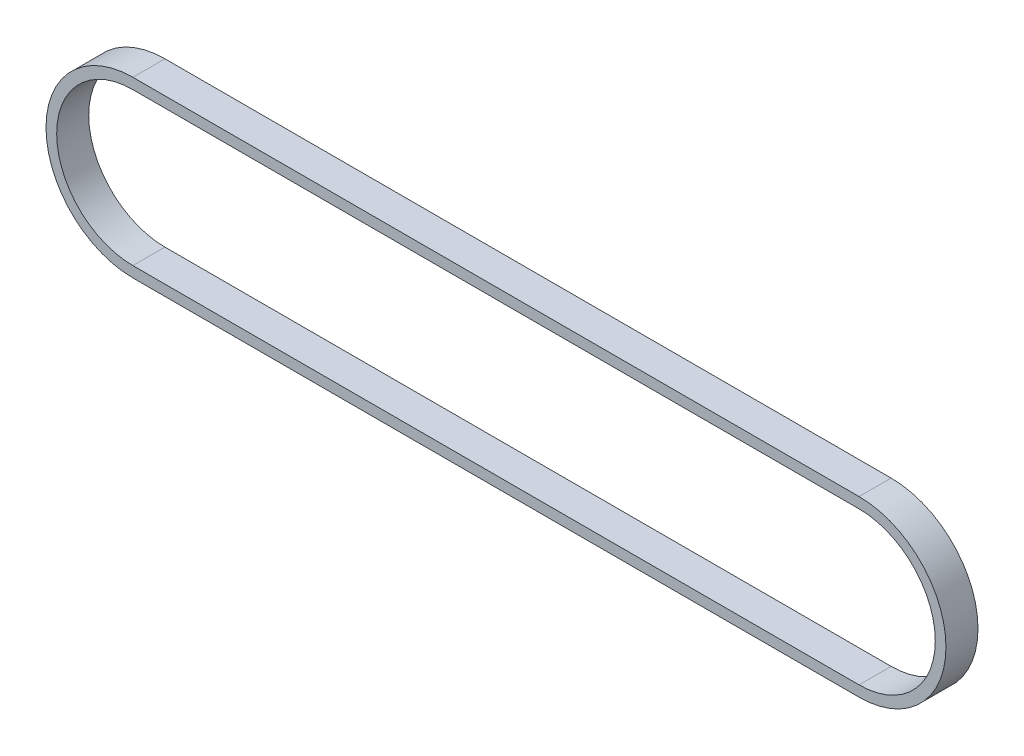
ISO-10303-21;
HEADER;
FILE_DESCRIPTION(('STEP AP214'),'2;1');
FILE_NAME('part.step','',(''),(''),'','','');
FILE_SCHEMA(('AUTOMOTIVE_DESIGN { 1 0 10303 214 1 1 1 1 }'));
ENDSEC;
DATA;
#1=APPLICATION_CONTEXT('core data for automotive mechanical design processes');
#2=APPLICATION_PROTOCOL_DEFINITION('international standard','automotive_design',2000,#1);
#3=PRODUCT_CONTEXT('',#1,'mechanical');
#4=PRODUCT('Part','Part','',(#3));
#5=PRODUCT_RELATED_PRODUCT_CATEGORY('part','',(#4));
#6=PRODUCT_DEFINITION_FORMATION('','',#4);
#7=PRODUCT_DEFINITION_CONTEXT('part definition',#1,'design');
#8=PRODUCT_DEFINITION('design','',#6,#7);
#9=PRODUCT_DEFINITION_SHAPE('','',#8);
#10=(LENGTH_UNIT() NAMED_UNIT(*) SI_UNIT(.MILLI.,.METRE.));
#11=(NAMED_UNIT(*) PLANE_ANGLE_UNIT() SI_UNIT($,.RADIAN.));
#12=(NAMED_UNIT(*) SI_UNIT($,.STERADIAN.) SOLID_ANGLE_UNIT());
#13=UNCERTAINTY_MEASURE_WITH_UNIT(LENGTH_MEASURE(1.E-05),#10,'distance_accuracy_value','');
#14=(GEOMETRIC_REPRESENTATION_CONTEXT(3) GLOBAL_UNCERTAINTY_ASSIGNED_CONTEXT((#13)) GLOBAL_UNIT_ASSIGNED_CONTEXT((#10,
#11,#12)) REPRESENTATION_CONTEXT('',''));
#15=CARTESIAN_POINT('',(0.,0.,0.));
#16=DIRECTION('',(0.,0.,1.));
#17=DIRECTION('',(1.,0.,0.));
#18=AXIS2_PLACEMENT_3D('',#15,#16,#17);
#19=CARTESIAN_POINT('',(0.,0.,4.5));
#20=DIRECTION('',(0.,0.,-1.));
#21=DIRECTION('',(-1.,0.,0.));
#22=AXIS2_PLACEMENT_3D('',#19,#20,#21);
#23=CYLINDRICAL_SURFACE('',#22,21.4);
#24=CARTESIAN_POINT('',(0.,0.,-4.5));
#25=DIRECTION('',(0.,0.,1.));
#26=DIRECTION('',(1.,0.,0.));
#27=AXIS2_PLACEMENT_3D('',#24,#25,#26);
#28=CIRCLE('',#27,21.4);
#29=CARTESIAN_POINT('',(0.,21.4,-4.5));
#30=VERTEX_POINT('',#29);
#31=CARTESIAN_POINT('',(0.,-21.4,-4.5));
#32=VERTEX_POINT('',#31);
#33=EDGE_CURVE('E145',#30,#32,#28,.T.);
#34=ORIENTED_EDGE('',*,*,#33,.F.);
#35=DIRECTION('',(0.,0.,-1.));
#36=VECTOR('',#35,1.);
#37=CARTESIAN_POINT('',(0.,21.4,4.5));
#38=LINE('',#37,#36);
#39=CARTESIAN_POINT('',(0.,21.4,4.5));
#40=VERTEX_POINT('',#39);
#41=EDGE_CURVE('E11',#40,#30,#38,.T.);
#42=ORIENTED_EDGE('',*,*,#41,.F.);
#43=CARTESIAN_POINT('',(0.,0.,4.5));
#44=DIRECTION('',(0.,0.,1.));
#45=DIRECTION('',(1.,0.,0.));
#46=AXIS2_PLACEMENT_3D('',#43,#44,#45);
#47=CIRCLE('',#46,21.4);
#48=CARTESIAN_POINT('',(0.,-21.4,4.5));
#49=VERTEX_POINT('',#48);
#50=EDGE_CURVE('E117',#40,#49,#47,.T.);
#51=ORIENTED_EDGE('',*,*,#50,.T.);
#52=DIRECTION('',(0.,0.,-1.));
#53=VECTOR('',#52,1.);
#54=CARTESIAN_POINT('',(0.,-21.4,4.5));
#55=LINE('',#54,#53);
#56=EDGE_CURVE('E56',#49,#32,#55,.T.);
#57=ORIENTED_EDGE('',*,*,#56,.T.);
#58=EDGE_LOOP('',(#34,#42,#51,#57));
#59=FACE_BOUND('',#58,.T.);
#60=ADVANCED_FACE('F37',(#59),#23,.F.);
#61=CARTESIAN_POINT('',(0.,21.4,4.5));
#62=DIRECTION('',(0.,1.,0.));
#63=DIRECTION('',(0.,0.,1.));
#64=AXIS2_PLACEMENT_3D('',#61,#62,#63);
#65=PLANE('',#64);
#66=DIRECTION('',(1.,0.,0.));
#67=VECTOR('',#66,1.);
#68=CARTESIAN_POINT('',(0.,21.4,-4.5));
#69=LINE('',#68,#67);
#70=CARTESIAN_POINT('',(203.94484,21.4,-4.5));
#71=VERTEX_POINT('',#70);
#72=EDGE_CURVE('E123',#30,#71,#69,.T.);
#73=ORIENTED_EDGE('',*,*,#72,.T.);
#74=DIRECTION('',(0.,0.,-1.));
#75=VECTOR('',#74,1.);
#76=CARTESIAN_POINT('',(203.94484,21.4,4.5));
#77=LINE('',#76,#75);
#78=CARTESIAN_POINT('',(203.94484,21.4,4.5));
#79=VERTEX_POINT('',#78);
#80=EDGE_CURVE('E47',#79,#71,#77,.T.);
#81=ORIENTED_EDGE('',*,*,#80,.F.);
#82=DIRECTION('',(1.,0.,0.));
#83=VECTOR('',#82,1.);
#84=CARTESIAN_POINT('',(0.,21.4,4.5));
#85=LINE('',#84,#83);
#86=EDGE_CURVE('E111',#40,#79,#85,.T.);
#87=ORIENTED_EDGE('',*,*,#86,.F.);
#88=ORIENTED_EDGE('',*,*,#41,.T.);
#89=EDGE_LOOP('',(#73,#81,#87,#88));
#90=FACE_BOUND('',#89,.T.);
#91=ADVANCED_FACE('F121',(#90),#65,.F.);
#92=CARTESIAN_POINT('',(203.94484,0.,4.5));
#93=DIRECTION('',(0.,0.,-1.));
#94=DIRECTION('',(-1.,0.,0.));
#95=AXIS2_PLACEMENT_3D('',#92,#93,#94);
#96=CYLINDRICAL_SURFACE('',#95,21.4);
#97=CARTESIAN_POINT('',(203.94484,0.,-4.5));
#98=DIRECTION('',(0.,0.,1.));
#99=DIRECTION('',(1.,0.,0.));
#100=AXIS2_PLACEMENT_3D('',#97,#98,#99);
#101=CIRCLE('',#100,21.4);
#102=CARTESIAN_POINT('',(203.94484,-21.4,-4.5));
#103=VERTEX_POINT('',#102);
#104=EDGE_CURVE('E148',#103,#71,#101,.T.);
#105=ORIENTED_EDGE('',*,*,#104,.F.);
#106=DIRECTION('',(0.,0.,-1.));
#107=VECTOR('',#106,1.);
#108=CARTESIAN_POINT('',(203.94484,-21.4,4.5));
#109=LINE('',#108,#107);
#110=CARTESIAN_POINT('',(203.94484,-21.4,4.5));
#111=VERTEX_POINT('',#110);
#112=EDGE_CURVE('E81',#111,#103,#109,.T.);
#113=ORIENTED_EDGE('',*,*,#112,.F.);
#114=CARTESIAN_POINT('',(203.94484,0.,4.5));
#115=DIRECTION('',(0.,0.,1.));
#116=DIRECTION('',(1.,0.,0.));
#117=AXIS2_PLACEMENT_3D('',#114,#115,#116);
#118=CIRCLE('',#117,21.4);
#119=EDGE_CURVE('E116',#111,#79,#118,.T.);
#120=ORIENTED_EDGE('',*,*,#119,.T.);
#121=ORIENTED_EDGE('',*,*,#80,.T.);
#122=EDGE_LOOP('',(#105,#113,#120,#121));
#123=FACE_BOUND('',#122,.T.);
#124=ADVANCED_FACE('F127',(#123),#96,.F.);
#125=CARTESIAN_POINT('',(0.,-24.4,4.5));
#126=DIRECTION('',(0.,1.,0.));
#127=DIRECTION('',(0.,0.,1.));
#128=AXIS2_PLACEMENT_3D('',#125,#126,#127);
#129=PLANE('',#128);
#130=DIRECTION('',(1.,0.,0.));
#131=VECTOR('',#130,1.);
#132=CARTESIAN_POINT('',(0.,-24.4,-4.5));
#133=LINE('',#132,#131);
#134=CARTESIAN_POINT('',(0.,-24.4,-4.5));
#135=VERTEX_POINT('',#134);
#136=CARTESIAN_POINT('',(203.94484,-24.4,-4.5));
#137=VERTEX_POINT('',#136);
#138=EDGE_CURVE('E134',#135,#137,#133,.T.);
#139=ORIENTED_EDGE('',*,*,#138,.T.);
#140=DIRECTION('',(0.,0.,-1.));
#141=VECTOR('',#140,1.);
#142=CARTESIAN_POINT('',(203.94484,-24.4,4.5));
#143=LINE('',#142,#141);
#144=CARTESIAN_POINT('',(203.94484,-24.4,4.5));
#145=VERTEX_POINT('',#144);
#146=EDGE_CURVE('E41',#145,#137,#143,.T.);
#147=ORIENTED_EDGE('',*,*,#146,.F.);
#148=DIRECTION('',(1.,0.,0.));
#149=VECTOR('',#148,1.);
#150=CARTESIAN_POINT('',(0.,-24.4,4.5));
#151=LINE('',#150,#149);
#152=CARTESIAN_POINT('',(0.,-24.4,4.5));
#153=VERTEX_POINT('',#152);
#154=EDGE_CURVE('E153',#153,#145,#151,.T.);
#155=ORIENTED_EDGE('',*,*,#154,.F.);
#156=DIRECTION('',(0.,0.,-1.));
#157=VECTOR('',#156,1.);
#158=CARTESIAN_POINT('',(0.,-24.4,4.5));
#159=LINE('',#158,#157);
#160=EDGE_CURVE('E130',#153,#135,#159,.T.);
#161=ORIENTED_EDGE('',*,*,#160,.T.);
#162=EDGE_LOOP('',(#139,#147,#155,#161));
#163=FACE_BOUND('',#162,.T.);
#164=ADVANCED_FACE('F39',(#163),#129,.F.);
#165=CARTESIAN_POINT('',(203.94484,0.,4.5));
#166=DIRECTION('',(0.,0.,-1.));
#167=DIRECTION('',(-1.,0.,0.));
#168=AXIS2_PLACEMENT_3D('',#165,#166,#167);
#169=CYLINDRICAL_SURFACE('',#168,24.4);
#170=CARTESIAN_POINT('',(203.94484,0.,-4.5));
#171=DIRECTION('',(0.,0.,1.));
#172=DIRECTION('',(1.,0.,0.));
#173=AXIS2_PLACEMENT_3D('',#170,#171,#172);
#174=CIRCLE('',#173,24.4);
#175=CARTESIAN_POINT('',(203.94484,24.4,-4.5));
#176=VERTEX_POINT('',#175);
#177=EDGE_CURVE('E137',#137,#176,#174,.T.);
#178=ORIENTED_EDGE('',*,*,#177,.T.);
#179=DIRECTION('',(0.,0.,-1.));
#180=VECTOR('',#179,1.);
#181=CARTESIAN_POINT('',(203.94484,24.4,4.5));
#182=LINE('',#181,#180);
#183=CARTESIAN_POINT('',(203.94484,24.4,4.5));
#184=VERTEX_POINT('',#183);
#185=EDGE_CURVE('E159',#184,#176,#182,.T.);
#186=ORIENTED_EDGE('',*,*,#185,.F.);
#187=CARTESIAN_POINT('',(203.94484,0.,4.5));
#188=DIRECTION('',(0.,0.,1.));
#189=DIRECTION('',(1.,0.,0.));
#190=AXIS2_PLACEMENT_3D('',#187,#188,#189);
#191=CIRCLE('',#190,24.4);
#192=EDGE_CURVE('E94',#145,#184,#191,.T.);
#193=ORIENTED_EDGE('',*,*,#192,.F.);
#194=ORIENTED_EDGE('',*,*,#146,.T.);
#195=EDGE_LOOP('',(#178,#186,#193,#194));
#196=FACE_BOUND('',#195,.T.);
#197=ADVANCED_FACE('F164',(#196),#169,.T.);
#198=CARTESIAN_POINT('',(0.,24.4,4.5));
#199=DIRECTION('',(0.,1.,0.));
#200=DIRECTION('',(0.,0.,1.));
#201=AXIS2_PLACEMENT_3D('',#198,#199,#200);
#202=PLANE('',#201);
#203=DIRECTION('',(1.,0.,0.));
#204=VECTOR('',#203,1.);
#205=CARTESIAN_POINT('',(0.,24.4,-4.5));
#206=LINE('',#205,#204);
#207=CARTESIAN_POINT('',(0.,24.4,-4.5));
#208=VERTEX_POINT('',#207);
#209=EDGE_CURVE('E140',#208,#176,#206,.T.);
#210=ORIENTED_EDGE('',*,*,#209,.F.);
#211=DIRECTION('',(0.,0.,-1.));
#212=VECTOR('',#211,1.);
#213=CARTESIAN_POINT('',(0.,24.4,4.5));
#214=LINE('',#213,#212);
#215=CARTESIAN_POINT('',(0.,24.4,4.5));
#216=VERTEX_POINT('',#215);
#217=EDGE_CURVE('E158',#216,#208,#214,.T.);
#218=ORIENTED_EDGE('',*,*,#217,.F.);
#219=DIRECTION('',(1.,0.,0.));
#220=VECTOR('',#219,1.);
#221=CARTESIAN_POINT('',(0.,24.4,4.5));
#222=LINE('',#221,#220);
#223=EDGE_CURVE('E176',#216,#184,#222,.T.);
#224=ORIENTED_EDGE('',*,*,#223,.T.);
#225=ORIENTED_EDGE('',*,*,#185,.T.);
#226=EDGE_LOOP('',(#210,#218,#224,#225));
#227=FACE_BOUND('',#226,.T.);
#228=ADVANCED_FACE('F173',(#227),#202,.T.);
#229=CARTESIAN_POINT('',(0.,0.,4.5));
#230=DIRECTION('',(0.,0.,-1.));
#231=DIRECTION('',(-1.,0.,0.));
#232=AXIS2_PLACEMENT_3D('',#229,#230,#231);
#233=CYLINDRICAL_SURFACE('',#232,24.4);
#234=CARTESIAN_POINT('',(0.,0.,-4.5));
#235=DIRECTION('',(0.,0.,1.));
#236=DIRECTION('',(1.,0.,0.));
#237=AXIS2_PLACEMENT_3D('',#234,#235,#236);
#238=CIRCLE('',#237,24.4);
#239=EDGE_CURVE('E143',#208,#135,#238,.T.);
#240=ORIENTED_EDGE('',*,*,#239,.T.);
#241=ORIENTED_EDGE('',*,*,#160,.F.);
#242=CARTESIAN_POINT('',(0.,0.,4.5));
#243=DIRECTION('',(0.,0.,1.));
#244=DIRECTION('',(1.,0.,0.));
#245=AXIS2_PLACEMENT_3D('',#242,#243,#244);
#246=CIRCLE('',#245,24.4);
#247=EDGE_CURVE('E178',#216,#153,#246,.T.);
#248=ORIENTED_EDGE('',*,*,#247,.F.);
#249=ORIENTED_EDGE('',*,*,#217,.T.);
#250=EDGE_LOOP('',(#240,#241,#248,#249));
#251=FACE_BOUND('',#250,.T.);
#252=ADVANCED_FACE('F179',(#251),#233,.T.);
#253=CARTESIAN_POINT('',(0.,-21.4,4.5));
#254=DIRECTION('',(0.,1.,0.));
#255=DIRECTION('',(0.,0.,1.));
#256=AXIS2_PLACEMENT_3D('',#253,#254,#255);
#257=PLANE('',#256);
#258=DIRECTION('',(1.,0.,0.));
#259=VECTOR('',#258,1.);
#260=CARTESIAN_POINT('',(0.,-21.4,-4.5));
#261=LINE('',#260,#259);
#262=EDGE_CURVE('E150',#32,#103,#261,.T.);
#263=ORIENTED_EDGE('',*,*,#262,.F.);
#264=ORIENTED_EDGE('',*,*,#56,.F.);
#265=DIRECTION('',(1.,0.,0.));
#266=VECTOR('',#265,1.);
#267=CARTESIAN_POINT('',(0.,-21.4,4.5));
#268=LINE('',#267,#266);
#269=EDGE_CURVE('E128',#49,#111,#268,.T.);
#270=ORIENTED_EDGE('',*,*,#269,.T.);
#271=ORIENTED_EDGE('',*,*,#112,.T.);
#272=EDGE_LOOP('',(#263,#264,#270,#271));
#273=FACE_BOUND('',#272,.T.);
#274=ADVANCED_FACE('F185',(#273),#257,.T.);
#275=CARTESIAN_POINT('',(0.,0.,4.5));
#276=DIRECTION('',(0.,0.,1.));
#277=DIRECTION('',(1.,0.,0.));
#278=AXIS2_PLACEMENT_3D('',#275,#276,#277);
#279=PLANE('',#278);
#280=ORIENTED_EDGE('',*,*,#154,.T.);
#281=ORIENTED_EDGE('',*,*,#192,.T.);
#282=ORIENTED_EDGE('',*,*,#223,.F.);
#283=ORIENTED_EDGE('',*,*,#247,.T.);
#284=EDGE_LOOP('',(#280,#281,#282,#283));
#285=FACE_BOUND('',#284,.T.);
#286=ORIENTED_EDGE('',*,*,#50,.F.);
#287=ORIENTED_EDGE('',*,*,#86,.T.);
#288=ORIENTED_EDGE('',*,*,#119,.F.);
#289=ORIENTED_EDGE('',*,*,#269,.F.);
#290=EDGE_LOOP('',(#286,#287,#288,#289));
#291=FACE_BOUND('',#290,.T.);
#292=ADVANCED_FACE('F113',(#285,#291),#279,.T.);
#293=CARTESIAN_POINT('',(0.,0.,-4.5));
#294=DIRECTION('',(0.,0.,1.));
#295=DIRECTION('',(1.,0.,0.));
#296=AXIS2_PLACEMENT_3D('',#293,#294,#295);
#297=PLANE('',#296);
#298=ORIENTED_EDGE('',*,*,#138,.F.);
#299=ORIENTED_EDGE('',*,*,#239,.F.);
#300=ORIENTED_EDGE('',*,*,#209,.T.);
#301=ORIENTED_EDGE('',*,*,#177,.F.);
#302=EDGE_LOOP('',(#298,#299,#300,#301));
#303=FACE_BOUND('',#302,.T.);
#304=ORIENTED_EDGE('',*,*,#33,.T.);
#305=ORIENTED_EDGE('',*,*,#262,.T.);
#306=ORIENTED_EDGE('',*,*,#104,.T.);
#307=ORIENTED_EDGE('',*,*,#72,.F.);
#308=EDGE_LOOP('',(#304,#305,#306,#307));
#309=FACE_BOUND('',#308,.T.);
#310=ADVANCED_FACE('F171',(#303,#309),#297,.F.);
#311=CLOSED_SHELL('',(#60,#91,#124,#164,#197,#228,#252,#274,#292,#310));
#312=MANIFOLD_SOLID_BREP('B2',#311);
#313=ADVANCED_BREP_SHAPE_REPRESENTATION('',(#18,#312),#14);
#314=SHAPE_DEFINITION_REPRESENTATION(#9,#313);
ENDSEC;
END-ISO-10303-21;
